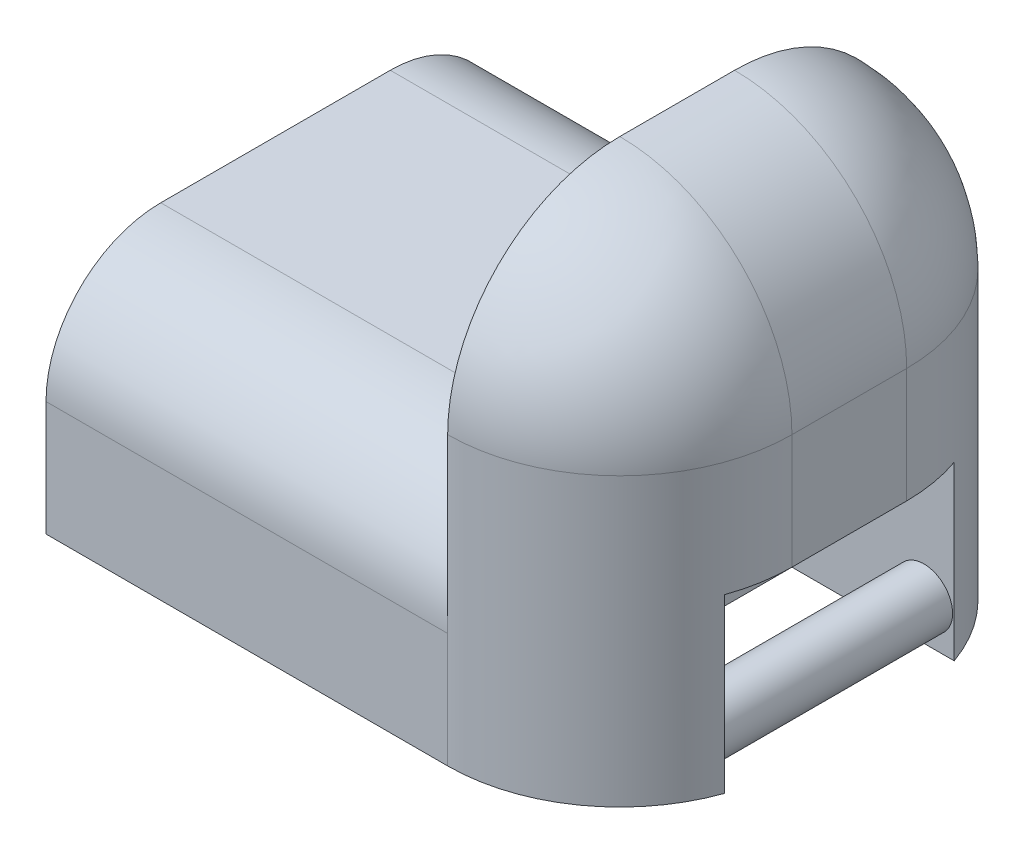
ISO-10303-21;
HEADER;
FILE_DESCRIPTION(('STEP AP214'),'2;1');
FILE_NAME('part.step','',(''),(''),'','','');
FILE_SCHEMA(('AUTOMOTIVE_DESIGN { 1 0 10303 214 1 1 1 1 }'));
ENDSEC;
DATA;
#1=APPLICATION_CONTEXT('core data for automotive mechanical design processes');
#2=APPLICATION_PROTOCOL_DEFINITION('international standard','automotive_design',2000,#1);
#3=PRODUCT_CONTEXT('',#1,'mechanical');
#4=PRODUCT('Part','Part','',(#3));
#5=PRODUCT_RELATED_PRODUCT_CATEGORY('part','',(#4));
#6=PRODUCT_DEFINITION_FORMATION('','',#4);
#7=PRODUCT_DEFINITION_CONTEXT('part definition',#1,'design');
#8=PRODUCT_DEFINITION('design','',#6,#7);
#9=PRODUCT_DEFINITION_SHAPE('','',#8);
#10=(LENGTH_UNIT() NAMED_UNIT(*) SI_UNIT(.MILLI.,.METRE.));
#11=(NAMED_UNIT(*) PLANE_ANGLE_UNIT() SI_UNIT($,.RADIAN.));
#12=(NAMED_UNIT(*) SI_UNIT($,.STERADIAN.) SOLID_ANGLE_UNIT());
#13=UNCERTAINTY_MEASURE_WITH_UNIT(LENGTH_MEASURE(1.E-05),#10,'distance_accuracy_value','');
#14=(GEOMETRIC_REPRESENTATION_CONTEXT(3) GLOBAL_UNCERTAINTY_ASSIGNED_CONTEXT((#13)) GLOBAL_UNIT_ASSIGNED_CONTEXT((#10,
#11,#12)) REPRESENTATION_CONTEXT('',''));
#15=CARTESIAN_POINT('',(0.,0.,0.));
#16=DIRECTION('',(0.,0.,1.));
#17=DIRECTION('',(1.,0.,0.));
#18=AXIS2_PLACEMENT_3D('',#15,#16,#17);
#19=CARTESIAN_POINT('',(-50.,80.,-20.));
#20=DIRECTION('',(1.,0.,0.));
#21=DIRECTION('',(0.,0.,-1.));
#22=AXIS2_PLACEMENT_3D('',#19,#20,#21);
#23=PLANE('',#22);
#24=DIRECTION('',(0.,0.,1.));
#25=VECTOR('',#24,1.);
#26=CARTESIAN_POINT('',(-50.,40.,-20.));
#27=LINE('',#26,#25);
#28=CARTESIAN_POINT('',(-50.,40.,0.));
#29=VERTEX_POINT('',#28);
#30=CARTESIAN_POINT('',(-50.,40.,40.));
#31=VERTEX_POINT('',#30);
#32=EDGE_CURVE('E339',#29,#31,#27,.T.);
#33=ORIENTED_EDGE('',*,*,#32,.F.);
#34=CARTESIAN_POINT('',(-50.,20.,0.));
#35=DIRECTION('',(1.,0.,0.));
#36=DIRECTION('',(0.,0.,-1.));
#37=AXIS2_PLACEMENT_3D('',#34,#35,#36);
#38=CIRCLE('',#37,20.);
#39=CARTESIAN_POINT('',(-50.,20.,-20.));
#40=VERTEX_POINT('',#39);
#41=EDGE_CURVE('E70',#29,#40,#38,.F.);
#42=ORIENTED_EDGE('',*,*,#41,.T.);
#43=DIRECTION('',(0.,-1.,0.));
#44=VECTOR('',#43,1.);
#45=CARTESIAN_POINT('',(-50.,80.,-20.));
#46=LINE('',#45,#44);
#47=CARTESIAN_POINT('',(-50.,0.,-20.));
#48=VERTEX_POINT('',#47);
#49=EDGE_CURVE('E257',#40,#48,#46,.T.);
#50=ORIENTED_EDGE('',*,*,#49,.T.);
#51=DIRECTION('',(0.,0.,1.));
#52=VECTOR('',#51,1.);
#53=CARTESIAN_POINT('',(-50.,0.,-20.));
#54=LINE('',#53,#52);
#55=CARTESIAN_POINT('',(-50.,0.,0.));
#56=VERTEX_POINT('',#55);
#57=EDGE_CURVE('E254',#48,#56,#54,.T.);
#58=ORIENTED_EDGE('',*,*,#57,.T.);
#59=DIRECTION('',(0.,-1.,0.));
#60=VECTOR('',#59,1.);
#61=CARTESIAN_POINT('',(-50.,0.,0.));
#62=LINE('',#61,#60);
#63=CARTESIAN_POINT('',(-50.,30.,0.));
#64=VERTEX_POINT('',#63);
#65=EDGE_CURVE('E243',#64,#56,#62,.T.);
#66=ORIENTED_EDGE('',*,*,#65,.F.);
#67=DIRECTION('',(0.,0.,1.));
#68=VECTOR('',#67,1.);
#69=CARTESIAN_POINT('',(-50.,30.,0.));
#70=LINE('',#69,#68);
#71=CARTESIAN_POINT('',(-50.,30.,40.));
#72=VERTEX_POINT('',#71);
#73=EDGE_CURVE('E246',#64,#72,#70,.T.);
#74=ORIENTED_EDGE('',*,*,#73,.T.);
#75=DIRECTION('',(0.,-1.,0.));
#76=VECTOR('',#75,1.);
#77=CARTESIAN_POINT('',(-50.,0.,40.));
#78=LINE('',#77,#76);
#79=CARTESIAN_POINT('',(-50.,0.,40.));
#80=VERTEX_POINT('',#79);
#81=EDGE_CURVE('E207',#72,#80,#78,.T.);
#82=ORIENTED_EDGE('',*,*,#81,.T.);
#83=DIRECTION('',(0.,0.,-1.));
#84=VECTOR('',#83,1.);
#85=CARTESIAN_POINT('',(-50.,0.,60.));
#86=LINE('',#85,#84);
#87=CARTESIAN_POINT('',(-50.,0.,60.));
#88=VERTEX_POINT('',#87);
#89=EDGE_CURVE('E216',#88,#80,#86,.T.);
#90=ORIENTED_EDGE('',*,*,#89,.F.);
#91=DIRECTION('',(0.,-1.,0.));
#92=VECTOR('',#91,1.);
#93=CARTESIAN_POINT('',(-50.,80.,60.));
#94=LINE('',#93,#92);
#95=CARTESIAN_POINT('',(-50.,20.,60.));
#96=VERTEX_POINT('',#95);
#97=EDGE_CURVE('E222',#96,#88,#94,.T.);
#98=ORIENTED_EDGE('',*,*,#97,.F.);
#99=CARTESIAN_POINT('',(-50.,20.,40.));
#100=DIRECTION('',(1.,0.,0.));
#101=DIRECTION('',(0.,0.,-1.));
#102=AXIS2_PLACEMENT_3D('',#99,#100,#101);
#103=CIRCLE('',#102,20.);
#104=EDGE_CURVE('E309',#96,#31,#103,.F.);
#105=ORIENTED_EDGE('',*,*,#104,.T.);
#106=EDGE_LOOP('',(#33,#42,#50,#58,#66,#74,#82,#90,#98,#105));
#107=FACE_BOUND('',#106,.T.);
#108=ADVANCED_FACE('F48',(#107),#23,.F.);
#109=CARTESIAN_POINT('',(50.,80.,-20.));
#110=DIRECTION('',(-1.,0.,0.));
#111=DIRECTION('',(0.,0.,1.));
#112=AXIS2_PLACEMENT_3D('',#109,#110,#111);
#113=PLANE('',#112);
#114=DIRECTION('',(0.,0.,1.));
#115=VECTOR('',#114,1.);
#116=CARTESIAN_POINT('',(50.,30.,0.));
#117=LINE('',#116,#115);
#118=CARTESIAN_POINT('',(50.,30.,9.99999999999999));
#119=VERTEX_POINT('',#118);
#120=CARTESIAN_POINT('',(50.,30.,30.));
#121=VERTEX_POINT('',#120);
#122=EDGE_CURVE('E192',#119,#121,#117,.T.);
#123=ORIENTED_EDGE('',*,*,#122,.F.);
#124=DIRECTION('',(0.,-1.,0.));
#125=VECTOR('',#124,1.);
#126=CARTESIAN_POINT('',(50.,80.,9.99999999999999));
#127=LINE('',#126,#125);
#128=CARTESIAN_POINT('',(50.,50.,9.99999999999999));
#129=VERTEX_POINT('',#128);
#130=EDGE_CURVE('E296',#119,#129,#127,.F.);
#131=ORIENTED_EDGE('',*,*,#130,.T.);
#132=DIRECTION('',(0.,0.,-1.));
#133=VECTOR('',#132,1.);
#134=CARTESIAN_POINT('',(50.,50.,60.));
#135=LINE('',#134,#133);
#136=CARTESIAN_POINT('',(50.,50.,30.));
#137=VERTEX_POINT('',#136);
#138=EDGE_CURVE('E265',#129,#137,#135,.F.);
#139=ORIENTED_EDGE('',*,*,#138,.T.);
#140=DIRECTION('',(0.,-1.,0.));
#141=VECTOR('',#140,1.);
#142=CARTESIAN_POINT('',(50.,0.,30.));
#143=LINE('',#142,#141);
#144=EDGE_CURVE('E267',#137,#121,#143,.T.);
#145=ORIENTED_EDGE('',*,*,#144,.T.);
#146=EDGE_LOOP('',(#123,#131,#139,#145));
#147=FACE_BOUND('',#146,.T.);
#148=ADVANCED_FACE('F358',(#147),#113,.F.);
#149=CARTESIAN_POINT('',(0.,0.,0.));
#150=DIRECTION('',(0.,1.,0.));
#151=DIRECTION('',(0.,0.,1.));
#152=AXIS2_PLACEMENT_3D('',#149,#150,#151);
#153=PLANE('',#152);
#154=DIRECTION('',(-1.,0.,0.));
#155=VECTOR('',#154,1.);
#156=CARTESIAN_POINT('',(-50.,0.,-20.));
#157=LINE('',#156,#155);
#158=CARTESIAN_POINT('',(20.,0.,-20.));
#159=VERTEX_POINT('',#158);
#160=EDGE_CURVE('E248',#159,#48,#157,.T.);
#161=ORIENTED_EDGE('',*,*,#160,.F.);
#162=CARTESIAN_POINT('',(20.,0.,10.));
#163=DIRECTION('',(0.,1.,0.));
#164=DIRECTION('',(0.,0.,1.));
#165=AXIS2_PLACEMENT_3D('',#162,#163,#164);
#166=CIRCLE('',#165,30.);
#167=CARTESIAN_POINT('',(48.2842712474619,0.,0.));
#168=VERTEX_POINT('',#167);
#169=EDGE_CURVE('E290',#159,#168,#166,.F.);
#170=ORIENTED_EDGE('',*,*,#169,.T.);
#171=DIRECTION('',(1.,0.,0.));
#172=VECTOR('',#171,1.);
#173=CARTESIAN_POINT('',(0.,0.,0.));
#174=LINE('',#173,#172);
#175=CARTESIAN_POINT('',(20.,0.,0.));
#176=VERTEX_POINT('',#175);
#177=EDGE_CURVE('E228',#176,#168,#174,.T.);
#178=ORIENTED_EDGE('',*,*,#177,.F.);
#179=DIRECTION('',(0.,0.,1.));
#180=VECTOR('',#179,1.);
#181=CARTESIAN_POINT('',(20.,0.,0.));
#182=LINE('',#181,#180);
#183=CARTESIAN_POINT('',(20.,0.,40.));
#184=VERTEX_POINT('',#183);
#185=EDGE_CURVE('E232',#176,#184,#182,.T.);
#186=ORIENTED_EDGE('',*,*,#185,.T.);
#187=DIRECTION('',(1.,0.,0.));
#188=VECTOR('',#187,1.);
#189=CARTESIAN_POINT('',(0.,0.,40.));
#190=LINE('',#189,#188);
#191=CARTESIAN_POINT('',(48.2842712474619,0.,40.));
#192=VERTEX_POINT('',#191);
#193=EDGE_CURVE('E182',#184,#192,#190,.T.);
#194=ORIENTED_EDGE('',*,*,#193,.T.);
#195=CARTESIAN_POINT('',(20.,0.,30.));
#196=DIRECTION('',(0.,1.,0.));
#197=DIRECTION('',(0.,0.,1.));
#198=AXIS2_PLACEMENT_3D('',#195,#196,#197);
#199=CIRCLE('',#198,30.);
#200=CARTESIAN_POINT('',(20.,0.,60.));
#201=VERTEX_POINT('',#200);
#202=EDGE_CURVE('E273',#192,#201,#199,.F.);
#203=ORIENTED_EDGE('',*,*,#202,.T.);
#204=DIRECTION('',(-1.,0.,0.));
#205=VECTOR('',#204,1.);
#206=CARTESIAN_POINT('',(-50.,0.,60.));
#207=LINE('',#206,#205);
#208=EDGE_CURVE('E219',#201,#88,#207,.T.);
#209=ORIENTED_EDGE('',*,*,#208,.T.);
#210=ORIENTED_EDGE('',*,*,#89,.T.);
#211=DIRECTION('',(1.,0.,0.));
#212=VECTOR('',#211,1.);
#213=CARTESIAN_POINT('',(0.,0.,40.));
#214=LINE('',#213,#212);
#215=CARTESIAN_POINT('',(-20.,0.,40.));
#216=VERTEX_POINT('',#215);
#217=EDGE_CURVE('E204',#80,#216,#214,.T.);
#218=ORIENTED_EDGE('',*,*,#217,.T.);
#219=DIRECTION('',(0.,0.,1.));
#220=VECTOR('',#219,1.);
#221=CARTESIAN_POINT('',(-20.,0.,0.));
#222=LINE('',#221,#220);
#223=CARTESIAN_POINT('',(-20.,0.,0.));
#224=VERTEX_POINT('',#223);
#225=EDGE_CURVE('E245',#224,#216,#222,.T.);
#226=ORIENTED_EDGE('',*,*,#225,.F.);
#227=DIRECTION('',(1.,0.,0.));
#228=VECTOR('',#227,1.);
#229=CARTESIAN_POINT('',(0.,0.,0.));
#230=LINE('',#229,#228);
#231=EDGE_CURVE('E191',#56,#224,#230,.T.);
#232=ORIENTED_EDGE('',*,*,#231,.F.);
#233=ORIENTED_EDGE('',*,*,#57,.F.);
#234=EDGE_LOOP('',(#161,#170,#178,#186,#194,#203,#209,#210,#218,#226,#232,#233));
#235=FACE_BOUND('',#234,.T.);
#236=ADVANCED_FACE('F369',(#235),#153,.F.);
#237=CARTESIAN_POINT('',(-50.,80.,-20.));
#238=DIRECTION('',(0.,0.,1.));
#239=DIRECTION('',(1.,0.,0.));
#240=AXIS2_PLACEMENT_3D('',#237,#238,#239);
#241=PLANE('',#240);
#242=ORIENTED_EDGE('',*,*,#49,.F.);
#243=DIRECTION('',(-1.,0.,0.));
#244=VECTOR('',#243,1.);
#245=CARTESIAN_POINT('',(20.,20.,-20.));
#246=LINE('',#245,#244);
#247=CARTESIAN_POINT('',(20.,20.,-20.));
#248=VERTEX_POINT('',#247);
#249=EDGE_CURVE('E56',#40,#248,#246,.F.);
#250=ORIENTED_EDGE('',*,*,#249,.T.);
#251=DIRECTION('',(0.,-1.,0.));
#252=VECTOR('',#251,1.);
#253=CARTESIAN_POINT('',(20.,80.,-20.));
#254=LINE('',#253,#252);
#255=EDGE_CURVE('E283',#248,#159,#254,.T.);
#256=ORIENTED_EDGE('',*,*,#255,.T.);
#257=ORIENTED_EDGE('',*,*,#160,.T.);
#258=EDGE_LOOP('',(#242,#250,#256,#257));
#259=FACE_BOUND('',#258,.T.);
#260=ADVANCED_FACE('F321',(#259),#241,.F.);
#261=CARTESIAN_POINT('',(0.,30.,0.));
#262=DIRECTION('',(0.,-1.,0.));
#263=DIRECTION('',(1.,0.,0.));
#264=AXIS2_PLACEMENT_3D('',#261,#262,#263);
#265=PLANE('',#264);
#266=DIRECTION('',(0.,0.,1.));
#267=VECTOR('',#266,1.);
#268=CARTESIAN_POINT('',(-20.,30.,0.));
#269=LINE('',#268,#267);
#270=CARTESIAN_POINT('',(-20.,30.,0.));
#271=VERTEX_POINT('',#270);
#272=CARTESIAN_POINT('',(-20.,30.,40.));
#273=VERTEX_POINT('',#272);
#274=EDGE_CURVE('E249',#271,#273,#269,.T.);
#275=ORIENTED_EDGE('',*,*,#274,.T.);
#276=DIRECTION('',(1.,0.,0.));
#277=VECTOR('',#276,1.);
#278=CARTESIAN_POINT('',(0.,30.,40.));
#279=LINE('',#278,#277);
#280=EDGE_CURVE('E210',#72,#273,#279,.T.);
#281=ORIENTED_EDGE('',*,*,#280,.F.);
#282=ORIENTED_EDGE('',*,*,#73,.F.);
#283=DIRECTION('',(1.,0.,0.));
#284=VECTOR('',#283,1.);
#285=CARTESIAN_POINT('',(0.,30.,0.));
#286=LINE('',#285,#284);
#287=EDGE_CURVE('E241',#64,#271,#286,.T.);
#288=ORIENTED_EDGE('',*,*,#287,.T.);
#289=EDGE_LOOP('',(#275,#281,#282,#288));
#290=FACE_BOUND('',#289,.T.);
#291=ADVANCED_FACE('F397',(#290),#265,.T.);
#292=CARTESIAN_POINT('',(-20.,0.,0.));
#293=DIRECTION('',(1.,0.,0.));
#294=DIRECTION('',(0.,1.,0.));
#295=AXIS2_PLACEMENT_3D('',#292,#293,#294);
#296=PLANE('',#295);
#297=ORIENTED_EDGE('',*,*,#225,.T.);
#298=DIRECTION('',(0.,1.,0.));
#299=VECTOR('',#298,1.);
#300=CARTESIAN_POINT('',(-20.,0.,40.));
#301=LINE('',#300,#299);
#302=EDGE_CURVE('E213',#216,#273,#301,.T.);
#303=ORIENTED_EDGE('',*,*,#302,.T.);
#304=ORIENTED_EDGE('',*,*,#274,.F.);
#305=DIRECTION('',(0.,1.,0.));
#306=VECTOR('',#305,1.);
#307=CARTESIAN_POINT('',(-20.,0.,0.));
#308=LINE('',#307,#306);
#309=EDGE_CURVE('E238',#224,#271,#308,.T.);
#310=ORIENTED_EDGE('',*,*,#309,.F.);
#311=EDGE_LOOP('',(#297,#303,#304,#310));
#312=FACE_BOUND('',#311,.T.);
#313=ADVANCED_FACE('F434',(#312),#296,.F.);
#314=CARTESIAN_POINT('',(0.,0.,0.));
#315=DIRECTION('',(0.,0.,1.));
#316=DIRECTION('',(1.,0.,0.));
#317=AXIS2_PLACEMENT_3D('',#314,#315,#316);
#318=PLANE('',#317);
#319=CARTESIAN_POINT('',(-43.,7.,0.));
#320=DIRECTION('',(0.,0.,1.));
#321=DIRECTION('',(1.,0.,0.));
#322=AXIS2_PLACEMENT_3D('',#319,#320,#321);
#323=CIRCLE('',#322,5.);
#324=CARTESIAN_POINT('',(-38.,7.,0.));
#325=VERTEX_POINT('',#324);
#326=EDGE_CURVE('E224',#325,#325,#323,.T.);
#327=ORIENTED_EDGE('',*,*,#326,.F.);
#328=EDGE_LOOP('',(#327));
#329=FACE_BOUND('',#328,.T.);
#330=ORIENTED_EDGE('',*,*,#231,.T.);
#331=ORIENTED_EDGE('',*,*,#309,.T.);
#332=ORIENTED_EDGE('',*,*,#287,.F.);
#333=ORIENTED_EDGE('',*,*,#65,.T.);
#334=EDGE_LOOP('',(#330,#331,#332,#333));
#335=FACE_BOUND('',#334,.T.);
#336=ADVANCED_FACE('F432',(#329,#335),#318,.T.);
#337=CARTESIAN_POINT('',(20.,0.,0.));
#338=DIRECTION('',(1.,0.,0.));
#339=DIRECTION('',(0.,0.,-1.));
#340=AXIS2_PLACEMENT_3D('',#337,#338,#339);
#341=PLANE('',#340);
#342=DIRECTION('',(0.,0.,1.));
#343=VECTOR('',#342,1.);
#344=CARTESIAN_POINT('',(20.,30.,0.));
#345=LINE('',#344,#343);
#346=CARTESIAN_POINT('',(20.,30.,0.));
#347=VERTEX_POINT('',#346);
#348=CARTESIAN_POINT('',(20.,30.,40.));
#349=VERTEX_POINT('',#348);
#350=EDGE_CURVE('E176',#347,#349,#345,.T.);
#351=ORIENTED_EDGE('',*,*,#350,.T.);
#352=DIRECTION('',(0.,1.,0.));
#353=VECTOR('',#352,1.);
#354=CARTESIAN_POINT('',(20.,0.,40.));
#355=LINE('',#354,#353);
#356=EDGE_CURVE('E183',#184,#349,#355,.T.);
#357=ORIENTED_EDGE('',*,*,#356,.F.);
#358=ORIENTED_EDGE('',*,*,#185,.F.);
#359=DIRECTION('',(0.,1.,0.));
#360=VECTOR('',#359,1.);
#361=CARTESIAN_POINT('',(20.,0.,0.));
#362=LINE('',#361,#360);
#363=EDGE_CURVE('E190',#176,#347,#362,.T.);
#364=ORIENTED_EDGE('',*,*,#363,.T.);
#365=EDGE_LOOP('',(#351,#357,#358,#364));
#366=FACE_BOUND('',#365,.T.);
#367=ADVANCED_FACE('F188',(#366),#341,.T.);
#368=CARTESIAN_POINT('',(0.,30.,0.));
#369=DIRECTION('',(0.,1.,0.));
#370=DIRECTION('',(-1.,0.,0.));
#371=AXIS2_PLACEMENT_3D('',#368,#369,#370);
#372=PLANE('',#371);
#373=DIRECTION('',(-1.,0.,0.));
#374=VECTOR('',#373,1.);
#375=CARTESIAN_POINT('',(0.,30.,0.));
#376=LINE('',#375,#374);
#377=CARTESIAN_POINT('',(48.2842712474619,30.,0.));
#378=VERTEX_POINT('',#377);
#379=EDGE_CURVE('E231',#378,#347,#376,.T.);
#380=ORIENTED_EDGE('',*,*,#379,.F.);
#381=CARTESIAN_POINT('',(20.,30.,10.));
#382=DIRECTION('',(0.,1.,0.));
#383=DIRECTION('',(-1.,0.,0.));
#384=AXIS2_PLACEMENT_3D('',#381,#382,#383);
#385=CIRCLE('',#384,30.);
#386=EDGE_CURVE('E294',#378,#119,#385,.F.);
#387=ORIENTED_EDGE('',*,*,#386,.T.);
#388=ORIENTED_EDGE('',*,*,#122,.T.);
#389=CARTESIAN_POINT('',(20.,30.,30.));
#390=DIRECTION('',(0.,1.,0.));
#391=DIRECTION('',(-1.,0.,0.));
#392=AXIS2_PLACEMENT_3D('',#389,#390,#391);
#393=CIRCLE('',#392,30.);
#394=CARTESIAN_POINT('',(48.2842712474619,30.,40.));
#395=VERTEX_POINT('',#394);
#396=EDGE_CURVE('E178',#121,#395,#393,.F.);
#397=ORIENTED_EDGE('',*,*,#396,.T.);
#398=DIRECTION('',(-1.,0.,0.));
#399=VECTOR('',#398,1.);
#400=CARTESIAN_POINT('',(0.,30.,40.));
#401=LINE('',#400,#399);
#402=EDGE_CURVE('E172',#395,#349,#401,.T.);
#403=ORIENTED_EDGE('',*,*,#402,.T.);
#404=ORIENTED_EDGE('',*,*,#350,.F.);
#405=EDGE_LOOP('',(#380,#387,#388,#397,#403,#404));
#406=FACE_BOUND('',#405,.T.);
#407=ADVANCED_FACE('F175',(#406),#372,.F.);
#408=CARTESIAN_POINT('',(0.,0.,0.));
#409=DIRECTION('',(0.,0.,1.));
#410=DIRECTION('',(1.,0.,0.));
#411=AXIS2_PLACEMENT_3D('',#408,#409,#410);
#412=PLANE('',#411);
#413=CARTESIAN_POINT('',(43.,7.,0.));
#414=DIRECTION('',(0.,0.,1.));
#415=DIRECTION('',(1.,0.,0.));
#416=AXIS2_PLACEMENT_3D('',#413,#414,#415);
#417=CIRCLE('',#416,5.);
#418=CARTESIAN_POINT('',(48.,7.,0.));
#419=VERTEX_POINT('',#418);
#420=EDGE_CURVE('E259',#419,#419,#417,.T.);
#421=ORIENTED_EDGE('',*,*,#420,.F.);
#422=EDGE_LOOP('',(#421));
#423=FACE_BOUND('',#422,.T.);
#424=ORIENTED_EDGE('',*,*,#177,.T.);
#425=DIRECTION('',(0.,-1.,0.));
#426=VECTOR('',#425,1.);
#427=CARTESIAN_POINT('',(48.2842712474619,0.,0.));
#428=LINE('',#427,#426);
#429=EDGE_CURVE('E292',#168,#378,#428,.F.);
#430=ORIENTED_EDGE('',*,*,#429,.T.);
#431=ORIENTED_EDGE('',*,*,#379,.T.);
#432=ORIENTED_EDGE('',*,*,#363,.F.);
#433=EDGE_LOOP('',(#424,#430,#431,#432));
#434=FACE_BOUND('',#433,.T.);
#435=ADVANCED_FACE('F373',(#423,#434),#412,.T.);
#436=CARTESIAN_POINT('',(-43.,7.,20.));
#437=DIRECTION('',(0.,0.,-1.));
#438=DIRECTION('',(-1.,0.,0.));
#439=AXIS2_PLACEMENT_3D('',#436,#437,#438);
#440=CYLINDRICAL_SURFACE('',#439,5.);
#441=ORIENTED_EDGE('',*,*,#326,.T.);
#442=EDGE_LOOP('',(#441));
#443=FACE_BOUND('',#442,.T.);
#444=CARTESIAN_POINT('',(-43.,7.,40.));
#445=DIRECTION('',(0.,0.,-1.));
#446=DIRECTION('',(-1.,0.,0.));
#447=AXIS2_PLACEMENT_3D('',#444,#445,#446);
#448=CIRCLE('',#447,5.);
#449=CARTESIAN_POINT('',(-48.,7.,40.));
#450=VERTEX_POINT('',#449);
#451=EDGE_CURVE('E262',#450,#450,#448,.T.);
#452=ORIENTED_EDGE('',*,*,#451,.T.);
#453=EDGE_LOOP('',(#452));
#454=FACE_BOUND('',#453,.T.);
#455=ADVANCED_FACE('F375',(#443,#454),#440,.T.);
#456=CARTESIAN_POINT('',(43.,7.,20.));
#457=DIRECTION('',(0.,0.,-1.));
#458=DIRECTION('',(-1.,0.,0.));
#459=AXIS2_PLACEMENT_3D('',#456,#457,#458);
#460=CYLINDRICAL_SURFACE('',#459,5.);
#461=ORIENTED_EDGE('',*,*,#420,.T.);
#462=EDGE_LOOP('',(#461));
#463=FACE_BOUND('',#462,.T.);
#464=CARTESIAN_POINT('',(43.,7.,40.));
#465=DIRECTION('',(0.,0.,1.));
#466=DIRECTION('',(1.,0.,0.));
#467=AXIS2_PLACEMENT_3D('',#464,#465,#466);
#468=CIRCLE('',#467,5.);
#469=CARTESIAN_POINT('',(48.,7.,40.));
#470=VERTEX_POINT('',#469);
#471=EDGE_CURVE('E197',#470,#470,#468,.F.);
#472=ORIENTED_EDGE('',*,*,#471,.T.);
#473=EDGE_LOOP('',(#472));
#474=FACE_BOUND('',#473,.T.);
#475=ADVANCED_FACE('F382',(#463,#474),#460,.T.);
#476=CARTESIAN_POINT('',(-50.,80.,60.));
#477=DIRECTION('',(0.,0.,1.));
#478=DIRECTION('',(1.,0.,0.));
#479=AXIS2_PLACEMENT_3D('',#476,#477,#478);
#480=PLANE('',#479);
#481=DIRECTION('',(0.,-1.,0.));
#482=VECTOR('',#481,1.);
#483=CARTESIAN_POINT('',(20.,50.,60.));
#484=LINE('',#483,#482);
#485=CARTESIAN_POINT('',(20.,20.,60.));
#486=VERTEX_POINT('',#485);
#487=EDGE_CURVE('E275',#201,#486,#484,.F.);
#488=ORIENTED_EDGE('',*,*,#487,.T.);
#489=DIRECTION('',(1.,0.,0.));
#490=VECTOR('',#489,1.);
#491=CARTESIAN_POINT('',(-50.,20.,60.));
#492=LINE('',#491,#490);
#493=EDGE_CURVE('E307',#486,#96,#492,.F.);
#494=ORIENTED_EDGE('',*,*,#493,.T.);
#495=ORIENTED_EDGE('',*,*,#97,.T.);
#496=ORIENTED_EDGE('',*,*,#208,.F.);
#497=EDGE_LOOP('',(#488,#494,#495,#496));
#498=FACE_BOUND('',#497,.T.);
#499=ADVANCED_FACE('F419',(#498),#480,.T.);
#500=CARTESIAN_POINT('',(0.,0.,40.));
#501=DIRECTION('',(0.,0.,-1.));
#502=DIRECTION('',(1.,0.,0.));
#503=AXIS2_PLACEMENT_3D('',#500,#501,#502);
#504=PLANE('',#503);
#505=ORIENTED_EDGE('',*,*,#451,.F.);
#506=EDGE_LOOP('',(#505));
#507=FACE_BOUND('',#506,.T.);
#508=ORIENTED_EDGE('',*,*,#217,.F.);
#509=ORIENTED_EDGE('',*,*,#81,.F.);
#510=ORIENTED_EDGE('',*,*,#280,.T.);
#511=ORIENTED_EDGE('',*,*,#302,.F.);
#512=EDGE_LOOP('',(#508,#509,#510,#511));
#513=FACE_BOUND('',#512,.T.);
#514=ADVANCED_FACE('F425',(#507,#513),#504,.T.);
#515=CARTESIAN_POINT('',(0.,0.,40.));
#516=DIRECTION('',(0.,0.,-1.));
#517=DIRECTION('',(1.,0.,0.));
#518=AXIS2_PLACEMENT_3D('',#515,#516,#517);
#519=PLANE('',#518);
#520=ORIENTED_EDGE('',*,*,#471,.F.);
#521=EDGE_LOOP('',(#520));
#522=FACE_BOUND('',#521,.T.);
#523=ORIENTED_EDGE('',*,*,#402,.F.);
#524=DIRECTION('',(0.,1.,0.));
#525=VECTOR('',#524,1.);
#526=CARTESIAN_POINT('',(48.2842712474619,30.,40.));
#527=LINE('',#526,#525);
#528=EDGE_CURVE('E271',#395,#192,#527,.F.);
#529=ORIENTED_EDGE('',*,*,#528,.T.);
#530=ORIENTED_EDGE('',*,*,#193,.F.);
#531=ORIENTED_EDGE('',*,*,#356,.T.);
#532=EDGE_LOOP('',(#523,#529,#530,#531));
#533=FACE_BOUND('',#532,.T.);
#534=ADVANCED_FACE('F195',(#522,#533),#519,.T.);
#535=CARTESIAN_POINT('',(20.,40.,-20.));
#536=DIRECTION('',(1.,0.,0.));
#537=DIRECTION('',(0.,0.,-1.));
#538=AXIS2_PLACEMENT_3D('',#535,#536,#537);
#539=PLANE('',#538);
#540=DIRECTION('',(0.,0.,-1.));
#541=VECTOR('',#540,1.);
#542=CARTESIAN_POINT('',(20.,80.,-20.));
#543=LINE('',#542,#541);
#544=CARTESIAN_POINT('',(20.,80.,30.));
#545=VERTEX_POINT('',#544);
#546=CARTESIAN_POINT('',(20.,80.,10.));
#547=VERTEX_POINT('',#546);
#548=EDGE_CURVE('E287',#545,#547,#543,.T.);
#549=ORIENTED_EDGE('',*,*,#548,.T.);
#550=CARTESIAN_POINT('',(20.,50.,10.));
#551=DIRECTION('',(1.,0.,0.));
#552=DIRECTION('',(0.,0.,-1.));
#553=AXIS2_PLACEMENT_3D('',#550,#551,#552);
#554=CIRCLE('',#553,30.);
#555=CARTESIAN_POINT('',(20.,50.,-20.));
#556=VERTEX_POINT('',#555);
#557=EDGE_CURVE('E300',#547,#556,#554,.F.);
#558=ORIENTED_EDGE('',*,*,#557,.T.);
#559=DIRECTION('',(0.,1.,0.));
#560=VECTOR('',#559,1.);
#561=CARTESIAN_POINT('',(20.,40.,-20.));
#562=LINE('',#561,#560);
#563=EDGE_CURVE('E62',#248,#556,#562,.T.);
#564=ORIENTED_EDGE('',*,*,#563,.F.);
#565=CARTESIAN_POINT('',(20.,20.,0.));
#566=DIRECTION('',(1.,0.,0.));
#567=DIRECTION('',(0.,0.,-1.));
#568=AXIS2_PLACEMENT_3D('',#565,#566,#567);
#569=CIRCLE('',#568,20.);
#570=CARTESIAN_POINT('',(20.,40.,0.));
#571=VERTEX_POINT('',#570);
#572=EDGE_CURVE('E13',#248,#571,#569,.T.);
#573=ORIENTED_EDGE('',*,*,#572,.T.);
#574=DIRECTION('',(0.,0.,-1.));
#575=VECTOR('',#574,1.);
#576=CARTESIAN_POINT('',(20.,40.,-20.));
#577=LINE('',#576,#575);
#578=CARTESIAN_POINT('',(20.,40.,40.));
#579=VERTEX_POINT('',#578);
#580=EDGE_CURVE('E334',#579,#571,#577,.T.);
#581=ORIENTED_EDGE('',*,*,#580,.F.);
#582=CARTESIAN_POINT('',(20.,20.,40.));
#583=DIRECTION('',(1.,0.,0.));
#584=DIRECTION('',(0.,0.,-1.));
#585=AXIS2_PLACEMENT_3D('',#582,#583,#584);
#586=CIRCLE('',#585,20.);
#587=EDGE_CURVE('E312',#579,#486,#586,.T.);
#588=ORIENTED_EDGE('',*,*,#587,.T.);
#589=DIRECTION('',(0.,1.,0.));
#590=VECTOR('',#589,1.);
#591=CARTESIAN_POINT('',(20.,40.,60.));
#592=LINE('',#591,#590);
#593=CARTESIAN_POINT('',(20.,50.,60.));
#594=VERTEX_POINT('',#593);
#595=EDGE_CURVE('E338',#486,#594,#592,.T.);
#596=ORIENTED_EDGE('',*,*,#595,.T.);
#597=CARTESIAN_POINT('',(20.,50.,30.));
#598=DIRECTION('',(1.,0.,0.));
#599=DIRECTION('',(0.,0.,-1.));
#600=AXIS2_PLACEMENT_3D('',#597,#598,#599);
#601=CIRCLE('',#600,30.);
#602=EDGE_CURVE('E278',#594,#545,#601,.F.);
#603=ORIENTED_EDGE('',*,*,#602,.T.);
#604=EDGE_LOOP('',(#549,#558,#564,#573,#581,#588,#596,#603));
#605=FACE_BOUND('',#604,.T.);
#606=ADVANCED_FACE('F333',(#605),#539,.F.);
#607=CARTESIAN_POINT('',(0.,40.,0.));
#608=DIRECTION('',(0.,1.,0.));
#609=DIRECTION('',(0.,0.,1.));
#610=AXIS2_PLACEMENT_3D('',#607,#608,#609);
#611=PLANE('',#610);
#612=ORIENTED_EDGE('',*,*,#580,.T.);
#613=DIRECTION('',(-1.,0.,0.));
#614=VECTOR('',#613,1.);
#615=CARTESIAN_POINT('',(-50.,40.,0.));
#616=LINE('',#615,#614);
#617=EDGE_CURVE('E315',#571,#29,#616,.T.);
#618=ORIENTED_EDGE('',*,*,#617,.T.);
#619=ORIENTED_EDGE('',*,*,#32,.T.);
#620=DIRECTION('',(1.,0.,0.));
#621=VECTOR('',#620,1.);
#622=CARTESIAN_POINT('',(0.,40.,40.));
#623=LINE('',#622,#621);
#624=EDGE_CURVE('E302',#31,#579,#623,.T.);
#625=ORIENTED_EDGE('',*,*,#624,.T.);
#626=EDGE_LOOP('',(#612,#618,#619,#625));
#627=FACE_BOUND('',#626,.T.);
#628=ADVANCED_FACE('F336',(#627),#611,.T.);
#629=CARTESIAN_POINT('',(20.,50.,0.));
#630=DIRECTION('',(0.,0.,1.));
#631=DIRECTION('',(1.,0.,0.));
#632=AXIS2_PLACEMENT_3D('',#629,#630,#631);
#633=CYLINDRICAL_SURFACE('',#632,30.);
#634=ORIENTED_EDGE('',*,*,#138,.F.);
#635=CARTESIAN_POINT('',(20.,50.,10.));
#636=DIRECTION('',(0.,0.,1.));
#637=DIRECTION('',(1.,0.,0.));
#638=AXIS2_PLACEMENT_3D('',#635,#636,#637);
#639=CIRCLE('',#638,30.);
#640=EDGE_CURVE('E298',#129,#547,#639,.T.);
#641=ORIENTED_EDGE('',*,*,#640,.T.);
#642=ORIENTED_EDGE('',*,*,#548,.F.);
#643=CARTESIAN_POINT('',(20.,50.,30.));
#644=DIRECTION('',(0.,0.,1.));
#645=DIRECTION('',(1.,0.,0.));
#646=AXIS2_PLACEMENT_3D('',#643,#644,#645);
#647=CIRCLE('',#646,30.);
#648=EDGE_CURVE('E280',#545,#137,#647,.F.);
#649=ORIENTED_EDGE('',*,*,#648,.T.);
#650=EDGE_LOOP('',(#634,#641,#642,#649));
#651=FACE_BOUND('',#650,.T.);
#652=ADVANCED_FACE('F359',(#651),#633,.T.);
#653=CARTESIAN_POINT('',(20.,50.,30.));
#654=DIRECTION('',(0.,0.,1.));
#655=DIRECTION('',(1.,0.,0.));
#656=AXIS2_PLACEMENT_3D('',#653,#654,#655);
#657=SPHERICAL_SURFACE('',#656,30.);
#658=ORIENTED_EDGE('',*,*,#648,.F.);
#659=ORIENTED_EDGE('',*,*,#602,.F.);
#660=CARTESIAN_POINT('',(20.,50.,30.));
#661=DIRECTION('',(0.,-1.,0.));
#662=DIRECTION('',(0.,0.,-1.));
#663=AXIS2_PLACEMENT_3D('',#660,#661,#662);
#664=CIRCLE('',#663,30.);
#665=EDGE_CURVE('E284',#137,#594,#664,.T.);
#666=ORIENTED_EDGE('',*,*,#665,.F.);
#667=EDGE_LOOP('',(#658,#659,#666));
#668=FACE_BOUND('',#667,.T.);
#669=ADVANCED_FACE('F363',(#668),#657,.T.);
#670=CARTESIAN_POINT('',(20.,80.,30.));
#671=DIRECTION('',(0.,1.,0.));
#672=DIRECTION('',(0.,0.,1.));
#673=AXIS2_PLACEMENT_3D('',#670,#671,#672);
#674=CYLINDRICAL_SURFACE('',#673,30.);
#675=ORIENTED_EDGE('',*,*,#595,.F.);
#676=ORIENTED_EDGE('',*,*,#487,.F.);
#677=ORIENTED_EDGE('',*,*,#202,.F.);
#678=ORIENTED_EDGE('',*,*,#528,.F.);
#679=ORIENTED_EDGE('',*,*,#396,.F.);
#680=ORIENTED_EDGE('',*,*,#144,.F.);
#681=ORIENTED_EDGE('',*,*,#665,.T.);
#682=EDGE_LOOP('',(#675,#676,#677,#678,#679,#680,#681));
#683=FACE_BOUND('',#682,.T.);
#684=ADVANCED_FACE('F365',(#683),#674,.T.);
#685=CARTESIAN_POINT('',(20.,50.,10.));
#686=DIRECTION('',(0.,0.,1.));
#687=DIRECTION('',(1.,0.,0.));
#688=AXIS2_PLACEMENT_3D('',#685,#686,#687);
#689=SPHERICAL_SURFACE('',#688,30.);
#690=ORIENTED_EDGE('',*,*,#557,.F.);
#691=ORIENTED_EDGE('',*,*,#640,.F.);
#692=CARTESIAN_POINT('',(20.,50.,10.));
#693=DIRECTION('',(0.,-1.,0.));
#694=DIRECTION('',(0.,0.,-1.));
#695=AXIS2_PLACEMENT_3D('',#692,#693,#694);
#696=CIRCLE('',#695,30.);
#697=EDGE_CURVE('E288',#556,#129,#696,.T.);
#698=ORIENTED_EDGE('',*,*,#697,.F.);
#699=EDGE_LOOP('',(#690,#691,#698));
#700=FACE_BOUND('',#699,.T.);
#701=ADVANCED_FACE('F352',(#700),#689,.T.);
#702=CARTESIAN_POINT('',(20.,80.,10.));
#703=DIRECTION('',(0.,-1.,0.));
#704=DIRECTION('',(0.,0.,-1.));
#705=AXIS2_PLACEMENT_3D('',#702,#703,#704);
#706=CYLINDRICAL_SURFACE('',#705,30.);
#707=ORIENTED_EDGE('',*,*,#697,.T.);
#708=ORIENTED_EDGE('',*,*,#130,.F.);
#709=ORIENTED_EDGE('',*,*,#386,.F.);
#710=ORIENTED_EDGE('',*,*,#429,.F.);
#711=ORIENTED_EDGE('',*,*,#169,.F.);
#712=ORIENTED_EDGE('',*,*,#255,.F.);
#713=ORIENTED_EDGE('',*,*,#563,.T.);
#714=EDGE_LOOP('',(#707,#708,#709,#710,#711,#712,#713));
#715=FACE_BOUND('',#714,.T.);
#716=ADVANCED_FACE('F327',(#715),#706,.T.);
#717=CARTESIAN_POINT('',(0.,20.,40.));
#718=DIRECTION('',(1.,0.,0.));
#719=DIRECTION('',(0.,0.,-1.));
#720=AXIS2_PLACEMENT_3D('',#717,#718,#719);
#721=CYLINDRICAL_SURFACE('',#720,20.);
#722=ORIENTED_EDGE('',*,*,#104,.F.);
#723=ORIENTED_EDGE('',*,*,#493,.F.);
#724=ORIENTED_EDGE('',*,*,#587,.F.);
#725=ORIENTED_EDGE('',*,*,#624,.F.);
#726=EDGE_LOOP('',(#722,#723,#724,#725));
#727=FACE_BOUND('',#726,.T.);
#728=ADVANCED_FACE('F407',(#727),#721,.T.);
#729=CARTESIAN_POINT('',(0.,20.,0.));
#730=DIRECTION('',(1.,0.,0.));
#731=DIRECTION('',(0.,0.,-1.));
#732=AXIS2_PLACEMENT_3D('',#729,#730,#731);
#733=CYLINDRICAL_SURFACE('',#732,20.);
#734=ORIENTED_EDGE('',*,*,#572,.F.);
#735=ORIENTED_EDGE('',*,*,#249,.F.);
#736=ORIENTED_EDGE('',*,*,#41,.F.);
#737=ORIENTED_EDGE('',*,*,#617,.F.);
#738=EDGE_LOOP('',(#734,#735,#736,#737));
#739=FACE_BOUND('',#738,.T.);
#740=ADVANCED_FACE('F50',(#739),#733,.T.);
#741=CLOSED_SHELL('',(#108,#148,#236,#260,#291,#313,#336,#367,#407,#435,#455,#475,#499,#514,
#534,#606,#628,#652,#669,#684,#701,#716,#728,#740));
#742=MANIFOLD_SOLID_BREP('B2',#741);
#743=ADVANCED_BREP_SHAPE_REPRESENTATION('',(#18,#742),#14);
#744=SHAPE_DEFINITION_REPRESENTATION(#9,#743);
ENDSEC;
END-ISO-10303-21;
